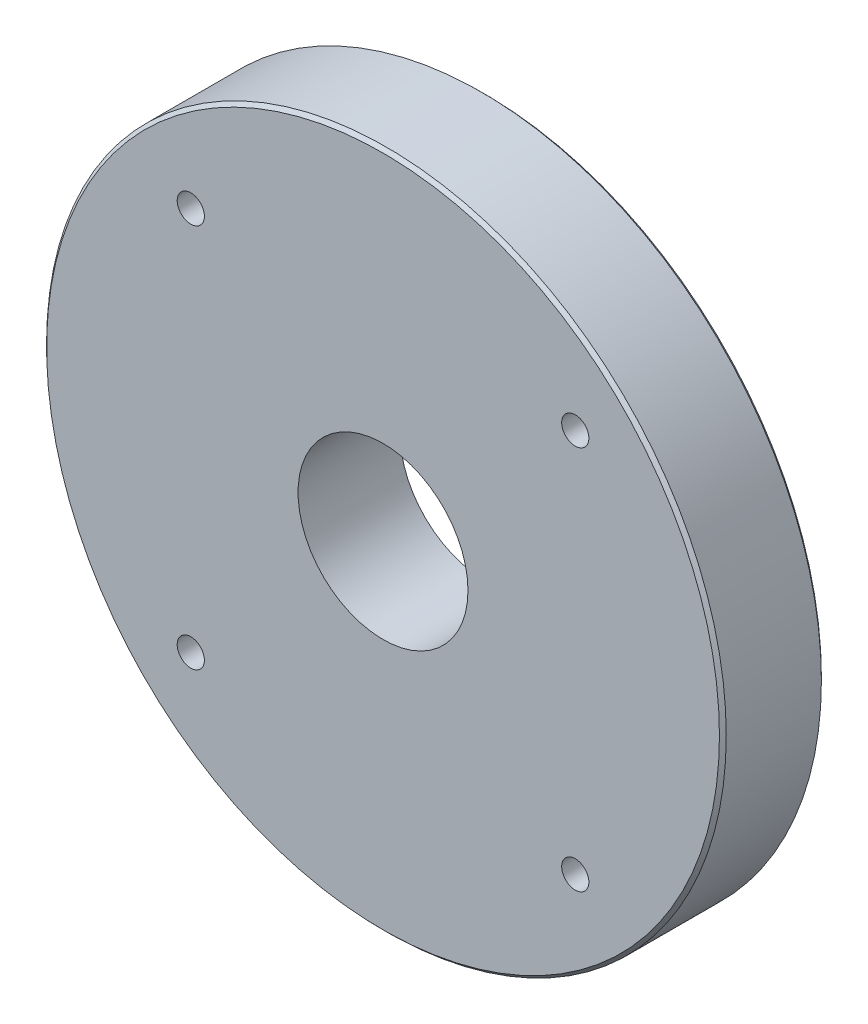
ISO-10303-21;
HEADER;
FILE_DESCRIPTION(('STEP AP214'),'2;1');
FILE_NAME('part.step','',(''),(''),'','','');
FILE_SCHEMA(('AUTOMOTIVE_DESIGN { 1 0 10303 214 1 1 1 1 }'));
ENDSEC;
DATA;
#1=APPLICATION_CONTEXT('core data for automotive mechanical design processes');
#2=APPLICATION_PROTOCOL_DEFINITION('international standard','automotive_design',2000,#1);
#3=PRODUCT_CONTEXT('',#1,'mechanical');
#4=PRODUCT('Part','Part','',(#3));
#5=PRODUCT_RELATED_PRODUCT_CATEGORY('part','',(#4));
#6=PRODUCT_DEFINITION_FORMATION('','',#4);
#7=PRODUCT_DEFINITION_CONTEXT('part definition',#1,'design');
#8=PRODUCT_DEFINITION('design','',#6,#7);
#9=PRODUCT_DEFINITION_SHAPE('','',#8);
#10=(LENGTH_UNIT() NAMED_UNIT(*) SI_UNIT(.MILLI.,.METRE.));
#11=(NAMED_UNIT(*) PLANE_ANGLE_UNIT() SI_UNIT($,.RADIAN.));
#12=(NAMED_UNIT(*) SI_UNIT($,.STERADIAN.) SOLID_ANGLE_UNIT());
#13=UNCERTAINTY_MEASURE_WITH_UNIT(LENGTH_MEASURE(1.E-05),#10,'distance_accuracy_value','');
#14=(GEOMETRIC_REPRESENTATION_CONTEXT(3) GLOBAL_UNCERTAINTY_ASSIGNED_CONTEXT((#13)) GLOBAL_UNIT_ASSIGNED_CONTEXT((#10,
#11,#12)) REPRESENTATION_CONTEXT('',''));
#15=CARTESIAN_POINT('',(0.,0.,0.));
#16=DIRECTION('',(0.,0.,1.));
#17=DIRECTION('',(1.,0.,0.));
#18=AXIS2_PLACEMENT_3D('',#15,#16,#17);
#19=CARTESIAN_POINT('',(0.,0.,30.));
#20=DIRECTION('',(0.,0.,-1.));
#21=DIRECTION('',(-1.,0.,0.));
#22=AXIS2_PLACEMENT_3D('',#19,#20,#21);
#23=CYLINDRICAL_SURFACE('',#22,100.);
#24=CARTESIAN_POINT('',(0.,0.,28.9999999999999));
#25=DIRECTION('',(0.,0.,1.));
#26=DIRECTION('',(1.,0.,0.));
#27=AXIS2_PLACEMENT_3D('',#24,#25,#26);
#28=CIRCLE('',#27,100.);
#29=CARTESIAN_POINT('',(100.,0.,28.9999999999999));
#30=VERTEX_POINT('',#29);
#31=EDGE_CURVE('E10',#30,#30,#28,.F.);
#32=ORIENTED_EDGE('',*,*,#31,.T.);
#33=EDGE_LOOP('',(#32));
#34=FACE_BOUND('',#33,.T.);
#35=CARTESIAN_POINT('',(0.,0.,1.00000000000001));
#36=DIRECTION('',(0.,0.,1.));
#37=DIRECTION('',(1.,0.,0.));
#38=AXIS2_PLACEMENT_3D('',#35,#36,#37);
#39=CIRCLE('',#38,100.);
#40=CARTESIAN_POINT('',(100.,0.,1.00000000000001));
#41=VERTEX_POINT('',#40);
#42=EDGE_CURVE('E54',#41,#41,#39,.T.);
#43=ORIENTED_EDGE('',*,*,#42,.T.);
#44=EDGE_LOOP('',(#43));
#45=FACE_BOUND('',#44,.T.);
#46=ADVANCED_FACE('F39',(#34,#45),#23,.T.);
#47=CARTESIAN_POINT('',(0.,0.,30.));
#48=DIRECTION('',(0.,0.,1.));
#49=DIRECTION('',(1.,0.,0.));
#50=AXIS2_PLACEMENT_3D('',#47,#48,#49);
#51=PLANE('',#50);
#52=CARTESIAN_POINT('',(0.,0.,30.));
#53=DIRECTION('',(0.,0.,1.));
#54=DIRECTION('',(1.,0.,0.));
#55=AXIS2_PLACEMENT_3D('',#52,#53,#54);
#56=CIRCLE('',#55,98.9999999999999);
#57=CARTESIAN_POINT('',(98.9999999999999,0.,30.));
#58=VERTEX_POINT('',#57);
#59=EDGE_CURVE('E50',#58,#58,#56,.T.);
#60=ORIENTED_EDGE('',*,*,#59,.T.);
#61=EDGE_LOOP('',(#60));
#62=FACE_BOUND('',#61,.T.);
#63=CARTESIAN_POINT('',(56.5685424949238,-56.5685424949238,30.));
#64=DIRECTION('',(0.,0.,1.));
#65=DIRECTION('',(1.,0.,0.));
#66=AXIS2_PLACEMENT_3D('',#63,#64,#65);
#67=CIRCLE('',#66,3.99999999999998);
#68=CARTESIAN_POINT('',(60.5685424949238,-56.5685424949238,30.));
#69=VERTEX_POINT('',#68);
#70=EDGE_CURVE('E85',#69,#69,#67,.T.);
#71=ORIENTED_EDGE('',*,*,#70,.F.);
#72=EDGE_LOOP('',(#71));
#73=FACE_BOUND('',#72,.T.);
#74=CARTESIAN_POINT('',(-56.5685424949238,-56.5685424949238,30.));
#75=DIRECTION('',(0.,0.,1.));
#76=DIRECTION('',(1.,0.,0.));
#77=AXIS2_PLACEMENT_3D('',#74,#75,#76);
#78=CIRCLE('',#77,3.99999999999998);
#79=CARTESIAN_POINT('',(-52.5685424949238,-56.5685424949238,30.));
#80=VERTEX_POINT('',#79);
#81=EDGE_CURVE('E84',#80,#80,#78,.T.);
#82=ORIENTED_EDGE('',*,*,#81,.F.);
#83=EDGE_LOOP('',(#82));
#84=FACE_BOUND('',#83,.T.);
#85=CARTESIAN_POINT('',(-56.5685424949238,56.5685424949238,30.));
#86=DIRECTION('',(0.,0.,1.));
#87=DIRECTION('',(1.,0.,0.));
#88=AXIS2_PLACEMENT_3D('',#85,#86,#87);
#89=CIRCLE('',#88,4.00000000000001);
#90=CARTESIAN_POINT('',(-52.5685424949238,56.5685424949238,30.));
#91=VERTEX_POINT('',#90);
#92=EDGE_CURVE('E81',#91,#91,#89,.T.);
#93=ORIENTED_EDGE('',*,*,#92,.F.);
#94=EDGE_LOOP('',(#93));
#95=FACE_BOUND('',#94,.T.);
#96=CARTESIAN_POINT('',(56.5685424949238,56.5685424949238,30.));
#97=DIRECTION('',(0.,0.,1.));
#98=DIRECTION('',(1.,0.,0.));
#99=AXIS2_PLACEMENT_3D('',#96,#97,#98);
#100=CIRCLE('',#99,4.00000000000001);
#101=CARTESIAN_POINT('',(60.5685424949238,56.5685424949238,30.));
#102=VERTEX_POINT('',#101);
#103=EDGE_CURVE('E74',#102,#102,#100,.T.);
#104=ORIENTED_EDGE('',*,*,#103,.F.);
#105=EDGE_LOOP('',(#104));
#106=FACE_BOUND('',#105,.T.);
#107=CARTESIAN_POINT('',(0.,0.,30.));
#108=DIRECTION('',(0.,0.,1.));
#109=DIRECTION('',(1.,0.,0.));
#110=AXIS2_PLACEMENT_3D('',#107,#108,#109);
#111=CIRCLE('',#110,25.);
#112=CARTESIAN_POINT('',(25.,0.,30.));
#113=VERTEX_POINT('',#112);
#114=EDGE_CURVE('E58',#113,#113,#111,.F.);
#115=ORIENTED_EDGE('',*,*,#114,.T.);
#116=EDGE_LOOP('',(#115));
#117=FACE_BOUND('',#116,.T.);
#118=ADVANCED_FACE('F94',(#62,#73,#84,#95,#106,#117),#51,.T.);
#119=CARTESIAN_POINT('',(0.,0.,0.));
#120=DIRECTION('',(0.,0.,1.));
#121=DIRECTION('',(1.,0.,0.));
#122=AXIS2_PLACEMENT_3D('',#119,#120,#121);
#123=PLANE('',#122);
#124=CARTESIAN_POINT('',(0.,0.,0.));
#125=DIRECTION('',(0.,0.,1.));
#126=DIRECTION('',(1.,0.,0.));
#127=AXIS2_PLACEMENT_3D('',#124,#125,#126);
#128=CIRCLE('',#127,99.);
#129=CARTESIAN_POINT('',(99.,0.,0.));
#130=VERTEX_POINT('',#129);
#131=EDGE_CURVE('E51',#130,#130,#128,.F.);
#132=ORIENTED_EDGE('',*,*,#131,.T.);
#133=EDGE_LOOP('',(#132));
#134=FACE_BOUND('',#133,.T.);
#135=CARTESIAN_POINT('',(56.5685424949238,-56.5685424949238,0.));
#136=DIRECTION('',(0.,0.,1.));
#137=DIRECTION('',(1.,0.,0.));
#138=AXIS2_PLACEMENT_3D('',#135,#136,#137);
#139=CIRCLE('',#138,3.99999999999998);
#140=CARTESIAN_POINT('',(60.5685424949238,-56.5685424949238,0.));
#141=VERTEX_POINT('',#140);
#142=EDGE_CURVE('E61',#141,#141,#139,.T.);
#143=ORIENTED_EDGE('',*,*,#142,.T.);
#144=EDGE_LOOP('',(#143));
#145=FACE_BOUND('',#144,.T.);
#146=CARTESIAN_POINT('',(-56.5685424949238,-56.5685424949238,0.));
#147=DIRECTION('',(0.,0.,1.));
#148=DIRECTION('',(1.,0.,0.));
#149=AXIS2_PLACEMENT_3D('',#146,#147,#148);
#150=CIRCLE('',#149,3.99999999999998);
#151=CARTESIAN_POINT('',(-52.5685424949238,-56.5685424949238,0.));
#152=VERTEX_POINT('',#151);
#153=EDGE_CURVE('E65',#152,#152,#150,.T.);
#154=ORIENTED_EDGE('',*,*,#153,.T.);
#155=EDGE_LOOP('',(#154));
#156=FACE_BOUND('',#155,.T.);
#157=CARTESIAN_POINT('',(-56.5685424949238,56.5685424949238,0.));
#158=DIRECTION('',(0.,0.,1.));
#159=DIRECTION('',(1.,0.,0.));
#160=AXIS2_PLACEMENT_3D('',#157,#158,#159);
#161=CIRCLE('',#160,4.00000000000001);
#162=CARTESIAN_POINT('',(-52.5685424949238,56.5685424949238,0.));
#163=VERTEX_POINT('',#162);
#164=EDGE_CURVE('E68',#163,#163,#161,.T.);
#165=ORIENTED_EDGE('',*,*,#164,.T.);
#166=EDGE_LOOP('',(#165));
#167=FACE_BOUND('',#166,.T.);
#168=CARTESIAN_POINT('',(56.5685424949238,56.5685424949238,0.));
#169=DIRECTION('',(0.,0.,1.));
#170=DIRECTION('',(1.,0.,0.));
#171=AXIS2_PLACEMENT_3D('',#168,#169,#170);
#172=CIRCLE('',#171,4.00000000000001);
#173=CARTESIAN_POINT('',(60.5685424949238,56.5685424949238,0.));
#174=VERTEX_POINT('',#173);
#175=EDGE_CURVE('E72',#174,#174,#172,.T.);
#176=ORIENTED_EDGE('',*,*,#175,.T.);
#177=EDGE_LOOP('',(#176));
#178=FACE_BOUND('',#177,.T.);
#179=CARTESIAN_POINT('',(0.,0.,0.));
#180=DIRECTION('',(0.,0.,1.));
#181=DIRECTION('',(1.,0.,0.));
#182=AXIS2_PLACEMENT_3D('',#179,#180,#181);
#183=CIRCLE('',#182,25.);
#184=CARTESIAN_POINT('',(25.,0.,0.));
#185=VERTEX_POINT('',#184);
#186=EDGE_CURVE('E63',#185,#185,#183,.T.);
#187=ORIENTED_EDGE('',*,*,#186,.T.);
#188=EDGE_LOOP('',(#187));
#189=FACE_BOUND('',#188,.T.);
#190=ADVANCED_FACE('F100',(#134,#145,#156,#167,#178,#189),#123,.F.);
#191=CARTESIAN_POINT('',(0.,0.,40.));
#192=DIRECTION('',(0.,0.,-1.));
#193=DIRECTION('',(-1.,0.,0.));
#194=AXIS2_PLACEMENT_3D('',#191,#192,#193);
#195=CYLINDRICAL_SURFACE('',#194,25.);
#196=ORIENTED_EDGE('',*,*,#114,.F.);
#197=EDGE_LOOP('',(#196));
#198=FACE_BOUND('',#197,.T.);
#199=ORIENTED_EDGE('',*,*,#186,.F.);
#200=EDGE_LOOP('',(#199));
#201=FACE_BOUND('',#200,.T.);
#202=ADVANCED_FACE('F103',(#198,#201),#195,.F.);
#203=CARTESIAN_POINT('',(56.5685424949238,56.5685424949238,-10.));
#204=DIRECTION('',(0.,0.,1.));
#205=DIRECTION('',(1.,0.,0.));
#206=AXIS2_PLACEMENT_3D('',#203,#204,#205);
#207=CYLINDRICAL_SURFACE('',#206,4.00000000000001);
#208=ORIENTED_EDGE('',*,*,#103,.T.);
#209=EDGE_LOOP('',(#208));
#210=FACE_BOUND('',#209,.T.);
#211=ORIENTED_EDGE('',*,*,#175,.F.);
#212=EDGE_LOOP('',(#211));
#213=FACE_BOUND('',#212,.T.);
#214=ADVANCED_FACE('F106',(#210,#213),#207,.F.);
#215=CARTESIAN_POINT('',(-56.5685424949238,56.5685424949238,-10.));
#216=DIRECTION('',(0.,0.,1.));
#217=DIRECTION('',(1.,0.,0.));
#218=AXIS2_PLACEMENT_3D('',#215,#216,#217);
#219=CYLINDRICAL_SURFACE('',#218,4.00000000000001);
#220=ORIENTED_EDGE('',*,*,#92,.T.);
#221=EDGE_LOOP('',(#220));
#222=FACE_BOUND('',#221,.T.);
#223=ORIENTED_EDGE('',*,*,#164,.F.);
#224=EDGE_LOOP('',(#223));
#225=FACE_BOUND('',#224,.T.);
#226=ADVANCED_FACE('F93',(#222,#225),#219,.F.);
#227=CARTESIAN_POINT('',(-56.5685424949238,-56.5685424949238,-10.));
#228=DIRECTION('',(0.,0.,1.));
#229=DIRECTION('',(1.,0.,0.));
#230=AXIS2_PLACEMENT_3D('',#227,#228,#229);
#231=CYLINDRICAL_SURFACE('',#230,3.99999999999998);
#232=ORIENTED_EDGE('',*,*,#81,.T.);
#233=EDGE_LOOP('',(#232));
#234=FACE_BOUND('',#233,.T.);
#235=ORIENTED_EDGE('',*,*,#153,.F.);
#236=EDGE_LOOP('',(#235));
#237=FACE_BOUND('',#236,.T.);
#238=ADVANCED_FACE('F134',(#234,#237),#231,.F.);
#239=CARTESIAN_POINT('',(56.5685424949238,-56.5685424949238,-10.));
#240=DIRECTION('',(0.,0.,1.));
#241=DIRECTION('',(1.,0.,0.));
#242=AXIS2_PLACEMENT_3D('',#239,#240,#241);
#243=CYLINDRICAL_SURFACE('',#242,3.99999999999998);
#244=ORIENTED_EDGE('',*,*,#70,.T.);
#245=EDGE_LOOP('',(#244));
#246=FACE_BOUND('',#245,.T.);
#247=ORIENTED_EDGE('',*,*,#142,.F.);
#248=EDGE_LOOP('',(#247));
#249=FACE_BOUND('',#248,.T.);
#250=ADVANCED_FACE('F130',(#246,#249),#243,.F.);
#251=CARTESIAN_POINT('',(0.,0.,1.00000000000001));
#252=DIRECTION('',(0.,0.,1.));
#253=DIRECTION('',(1.,0.,0.));
#254=AXIS2_PLACEMENT_3D('',#251,#252,#253);
#255=CONICAL_SURFACE('',#254,100.,0.785398163397448);
#256=ORIENTED_EDGE('',*,*,#131,.F.);
#257=EDGE_LOOP('',(#256));
#258=FACE_BOUND('',#257,.T.);
#259=ORIENTED_EDGE('',*,*,#42,.F.);
#260=EDGE_LOOP('',(#259));
#261=FACE_BOUND('',#260,.T.);
#262=ADVANCED_FACE('F122',(#258,#261),#255,.T.);
#263=CARTESIAN_POINT('',(0.,0.,30.));
#264=DIRECTION('',(0.,0.,-1.));
#265=DIRECTION('',(-1.,0.,0.));
#266=AXIS2_PLACEMENT_3D('',#263,#264,#265);
#267=CONICAL_SURFACE('',#266,98.9999999999999,0.785398163397448);
#268=ORIENTED_EDGE('',*,*,#31,.F.);
#269=EDGE_LOOP('',(#268));
#270=FACE_BOUND('',#269,.T.);
#271=ORIENTED_EDGE('',*,*,#59,.F.);
#272=EDGE_LOOP('',(#271));
#273=FACE_BOUND('',#272,.T.);
#274=ADVANCED_FACE('F45',(#270,#273),#267,.T.);
#275=CLOSED_SHELL('',(#46,#118,#190,#202,#214,#226,#238,#250,#262,#274));
#276=MANIFOLD_SOLID_BREP('B2',#275);
#277=ADVANCED_BREP_SHAPE_REPRESENTATION('',(#18,#276),#14);
#278=SHAPE_DEFINITION_REPRESENTATION(#9,#277);
ENDSEC;
END-ISO-10303-21;
